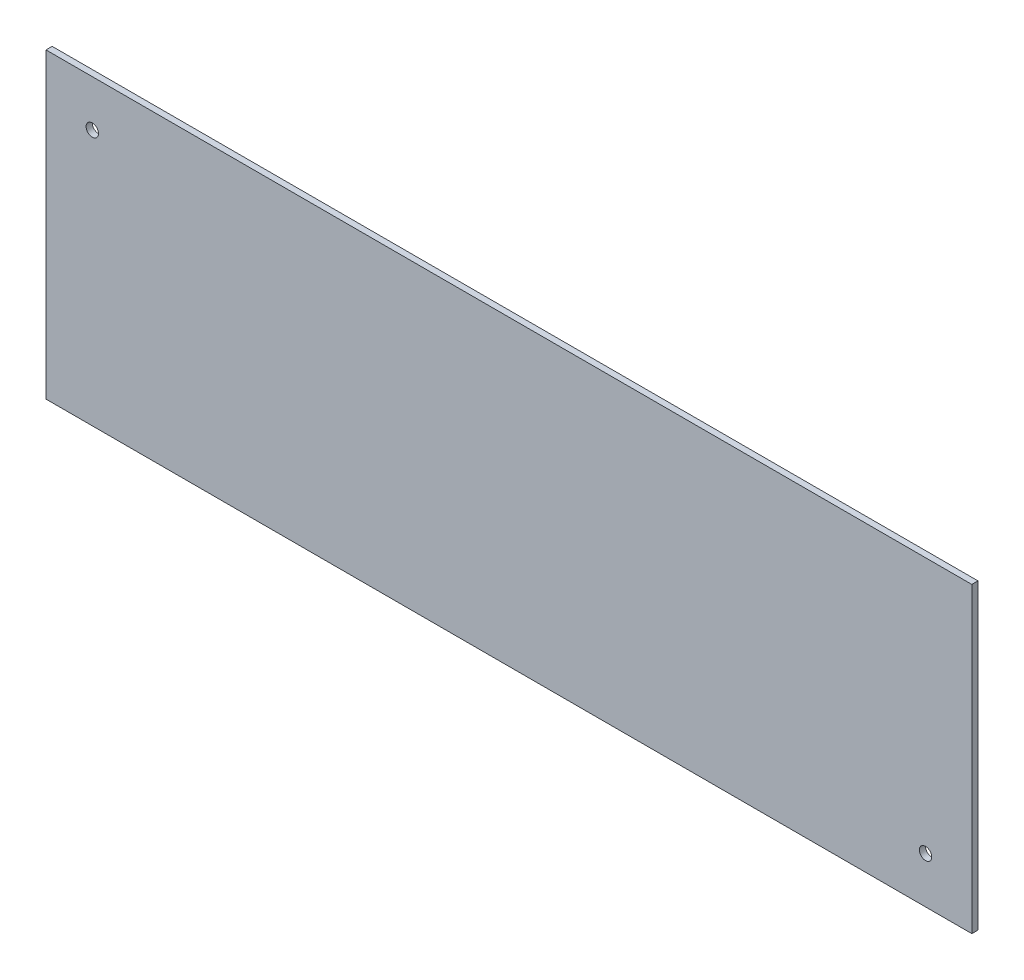
ISO-10303-21;
HEADER;
FILE_DESCRIPTION(('STEP AP214'),'2;1');
FILE_NAME('part.step','',(''),(''),'','','');
FILE_SCHEMA(('AUTOMOTIVE_DESIGN { 1 0 10303 214 1 1 1 1 }'));
ENDSEC;
DATA;
#1=APPLICATION_CONTEXT('core data for automotive mechanical design processes');
#2=APPLICATION_PROTOCOL_DEFINITION('international standard','automotive_design',2000,#1);
#3=PRODUCT_CONTEXT('',#1,'mechanical');
#4=PRODUCT('Part','Part','',(#3));
#5=PRODUCT_RELATED_PRODUCT_CATEGORY('part','',(#4));
#6=PRODUCT_DEFINITION_FORMATION('','',#4);
#7=PRODUCT_DEFINITION_CONTEXT('part definition',#1,'design');
#8=PRODUCT_DEFINITION('design','',#6,#7);
#9=PRODUCT_DEFINITION_SHAPE('','',#8);
#10=(LENGTH_UNIT() NAMED_UNIT(*) SI_UNIT(.MILLI.,.METRE.));
#11=(NAMED_UNIT(*) PLANE_ANGLE_UNIT() SI_UNIT($,.RADIAN.));
#12=(NAMED_UNIT(*) SI_UNIT($,.STERADIAN.) SOLID_ANGLE_UNIT());
#13=UNCERTAINTY_MEASURE_WITH_UNIT(LENGTH_MEASURE(1.E-05),#10,'distance_accuracy_value','');
#14=(GEOMETRIC_REPRESENTATION_CONTEXT(3) GLOBAL_UNCERTAINTY_ASSIGNED_CONTEXT((#13)) GLOBAL_UNIT_ASSIGNED_CONTEXT((#10,
#11,#12)) REPRESENTATION_CONTEXT('',''));
#15=CARTESIAN_POINT('',(0.,0.,0.));
#16=DIRECTION('',(0.,0.,1.));
#17=DIRECTION('',(1.,0.,0.));
#18=AXIS2_PLACEMENT_3D('',#15,#16,#17);
#19=CARTESIAN_POINT('',(150.,49.,2.));
#20=DIRECTION('',(-1.,0.,0.));
#21=DIRECTION('',(0.,0.,1.));
#22=AXIS2_PLACEMENT_3D('',#19,#20,#21);
#23=PLANE('',#22);
#24=DIRECTION('',(0.,1.,0.));
#25=VECTOR('',#24,1.);
#26=CARTESIAN_POINT('',(150.,49.,0.));
#27=LINE('',#26,#25);
#28=CARTESIAN_POINT('',(150.,-49.,0.));
#29=VERTEX_POINT('',#28);
#30=CARTESIAN_POINT('',(150.,49.,0.));
#31=VERTEX_POINT('',#30);
#32=EDGE_CURVE('E97',#29,#31,#27,.T.);
#33=ORIENTED_EDGE('',*,*,#32,.T.);
#34=DIRECTION('',(0.,0.,-1.));
#35=VECTOR('',#34,1.);
#36=CARTESIAN_POINT('',(150.,49.,2.));
#37=LINE('',#36,#35);
#38=CARTESIAN_POINT('',(150.,49.,2.));
#39=VERTEX_POINT('',#38);
#40=EDGE_CURVE('E11',#39,#31,#37,.T.);
#41=ORIENTED_EDGE('',*,*,#40,.F.);
#42=DIRECTION('',(0.,1.,0.));
#43=VECTOR('',#42,1.);
#44=CARTESIAN_POINT('',(150.,49.,2.));
#45=LINE('',#44,#43);
#46=CARTESIAN_POINT('',(150.,-49.,2.));
#47=VERTEX_POINT('',#46);
#48=EDGE_CURVE('E85',#47,#39,#45,.T.);
#49=ORIENTED_EDGE('',*,*,#48,.F.);
#50=DIRECTION('',(0.,0.,-1.));
#51=VECTOR('',#50,1.);
#52=CARTESIAN_POINT('',(150.,-49.,2.));
#53=LINE('',#52,#51);
#54=EDGE_CURVE('E93',#47,#29,#53,.T.);
#55=ORIENTED_EDGE('',*,*,#54,.T.);
#56=EDGE_LOOP('',(#33,#41,#49,#55));
#57=FACE_BOUND('',#56,.T.);
#58=ADVANCED_FACE('F34',(#57),#23,.F.);
#59=CARTESIAN_POINT('',(-150.,49.,2.));
#60=DIRECTION('',(0.,-1.,0.));
#61=DIRECTION('',(0.,0.,-1.));
#62=AXIS2_PLACEMENT_3D('',#59,#60,#61);
#63=PLANE('',#62);
#64=DIRECTION('',(-1.,0.,0.));
#65=VECTOR('',#64,1.);
#66=CARTESIAN_POINT('',(-150.,49.,0.));
#67=LINE('',#66,#65);
#68=CARTESIAN_POINT('',(-150.,49.,0.));
#69=VERTEX_POINT('',#68);
#70=EDGE_CURVE('E89',#31,#69,#67,.T.);
#71=ORIENTED_EDGE('',*,*,#70,.T.);
#72=DIRECTION('',(0.,0.,-1.));
#73=VECTOR('',#72,1.);
#74=CARTESIAN_POINT('',(-150.,49.,2.));
#75=LINE('',#74,#73);
#76=CARTESIAN_POINT('',(-150.,49.,2.));
#77=VERTEX_POINT('',#76);
#78=EDGE_CURVE('E42',#77,#69,#75,.T.);
#79=ORIENTED_EDGE('',*,*,#78,.F.);
#80=DIRECTION('',(-1.,0.,0.));
#81=VECTOR('',#80,1.);
#82=CARTESIAN_POINT('',(-150.,49.,2.));
#83=LINE('',#82,#81);
#84=EDGE_CURVE('E80',#39,#77,#83,.T.);
#85=ORIENTED_EDGE('',*,*,#84,.F.);
#86=ORIENTED_EDGE('',*,*,#40,.T.);
#87=EDGE_LOOP('',(#71,#79,#85,#86));
#88=FACE_BOUND('',#87,.T.);
#89=ADVANCED_FACE('F88',(#88),#63,.F.);
#90=CARTESIAN_POINT('',(-150.,49.,2.));
#91=DIRECTION('',(1.,0.,0.));
#92=DIRECTION('',(0.,0.,-1.));
#93=AXIS2_PLACEMENT_3D('',#90,#91,#92);
#94=PLANE('',#93);
#95=DIRECTION('',(0.,-1.,0.));
#96=VECTOR('',#95,1.);
#97=CARTESIAN_POINT('',(-150.,49.,0.));
#98=LINE('',#97,#96);
#99=CARTESIAN_POINT('',(-150.,-49.,0.));
#100=VERTEX_POINT('',#99);
#101=EDGE_CURVE('E67',#69,#100,#98,.T.);
#102=ORIENTED_EDGE('',*,*,#101,.T.);
#103=DIRECTION('',(0.,0.,-1.));
#104=VECTOR('',#103,1.);
#105=CARTESIAN_POINT('',(-150.,-49.,2.));
#106=LINE('',#105,#104);
#107=CARTESIAN_POINT('',(-150.,-49.,2.));
#108=VERTEX_POINT('',#107);
#109=EDGE_CURVE('E90',#108,#100,#106,.T.);
#110=ORIENTED_EDGE('',*,*,#109,.F.);
#111=DIRECTION('',(0.,-1.,0.));
#112=VECTOR('',#111,1.);
#113=CARTESIAN_POINT('',(-150.,49.,2.));
#114=LINE('',#113,#112);
#115=EDGE_CURVE('E83',#77,#108,#114,.T.);
#116=ORIENTED_EDGE('',*,*,#115,.F.);
#117=ORIENTED_EDGE('',*,*,#78,.T.);
#118=EDGE_LOOP('',(#102,#110,#116,#117));
#119=FACE_BOUND('',#118,.T.);
#120=ADVANCED_FACE('F91',(#119),#94,.F.);
#121=CARTESIAN_POINT('',(-150.,-49.,2.));
#122=DIRECTION('',(0.,1.,0.));
#123=DIRECTION('',(0.,0.,1.));
#124=AXIS2_PLACEMENT_3D('',#121,#122,#123);
#125=PLANE('',#124);
#126=DIRECTION('',(1.,0.,0.));
#127=VECTOR('',#126,1.);
#128=CARTESIAN_POINT('',(-150.,-49.,0.));
#129=LINE('',#128,#127);
#130=EDGE_CURVE('E73',#100,#29,#129,.T.);
#131=ORIENTED_EDGE('',*,*,#130,.T.);
#132=ORIENTED_EDGE('',*,*,#54,.F.);
#133=DIRECTION('',(1.,0.,0.));
#134=VECTOR('',#133,1.);
#135=CARTESIAN_POINT('',(-150.,-49.,2.));
#136=LINE('',#135,#134);
#137=EDGE_CURVE('E50',#108,#47,#136,.T.);
#138=ORIENTED_EDGE('',*,*,#137,.F.);
#139=ORIENTED_EDGE('',*,*,#109,.T.);
#140=EDGE_LOOP('',(#131,#132,#138,#139));
#141=FACE_BOUND('',#140,.T.);
#142=ADVANCED_FACE('F105',(#141),#125,.F.);
#143=CARTESIAN_POINT('',(0.,0.,2.));
#144=DIRECTION('',(0.,0.,1.));
#145=DIRECTION('',(1.,0.,0.));
#146=AXIS2_PLACEMENT_3D('',#143,#144,#145);
#147=PLANE('',#146);
#148=CARTESIAN_POINT('',(-135.,34.,2.));
#149=DIRECTION('',(0.,0.,1.));
#150=DIRECTION('',(1.,0.,0.));
#151=AXIS2_PLACEMENT_3D('',#148,#149,#150);
#152=CIRCLE('',#151,2.);
#153=CARTESIAN_POINT('',(-133.,34.,2.));
#154=VERTEX_POINT('',#153);
#155=EDGE_CURVE('E117',#154,#154,#152,.T.);
#156=ORIENTED_EDGE('',*,*,#155,.F.);
#157=EDGE_LOOP('',(#156));
#158=FACE_BOUND('',#157,.T.);
#159=CARTESIAN_POINT('',(135.,-34.,2.));
#160=DIRECTION('',(0.,0.,1.));
#161=DIRECTION('',(1.,0.,0.));
#162=AXIS2_PLACEMENT_3D('',#159,#160,#161);
#163=CIRCLE('',#162,2.);
#164=CARTESIAN_POINT('',(137.,-34.,2.));
#165=VERTEX_POINT('',#164);
#166=EDGE_CURVE('E111',#165,#165,#163,.T.);
#167=ORIENTED_EDGE('',*,*,#166,.F.);
#168=EDGE_LOOP('',(#167));
#169=FACE_BOUND('',#168,.T.);
#170=ORIENTED_EDGE('',*,*,#48,.T.);
#171=ORIENTED_EDGE('',*,*,#84,.T.);
#172=ORIENTED_EDGE('',*,*,#115,.T.);
#173=ORIENTED_EDGE('',*,*,#137,.T.);
#174=EDGE_LOOP('',(#170,#171,#172,#173));
#175=FACE_BOUND('',#174,.T.);
#176=ADVANCED_FACE('F81',(#158,#169,#175),#147,.T.);
#177=CARTESIAN_POINT('',(0.,0.,0.));
#178=DIRECTION('',(0.,0.,1.));
#179=DIRECTION('',(1.,0.,0.));
#180=AXIS2_PLACEMENT_3D('',#177,#178,#179);
#181=PLANE('',#180);
#182=CARTESIAN_POINT('',(-135.,34.,0.));
#183=DIRECTION('',(0.,0.,1.));
#184=DIRECTION('',(1.,0.,0.));
#185=AXIS2_PLACEMENT_3D('',#182,#183,#184);
#186=CIRCLE('',#185,2.);
#187=CARTESIAN_POINT('',(-133.,34.,0.));
#188=VERTEX_POINT('',#187);
#189=EDGE_CURVE('E100',#188,#188,#186,.T.);
#190=ORIENTED_EDGE('',*,*,#189,.T.);
#191=EDGE_LOOP('',(#190));
#192=FACE_BOUND('',#191,.T.);
#193=CARTESIAN_POINT('',(135.,-34.,0.));
#194=DIRECTION('',(0.,0.,1.));
#195=DIRECTION('',(1.,0.,0.));
#196=AXIS2_PLACEMENT_3D('',#193,#194,#195);
#197=CIRCLE('',#196,2.);
#198=CARTESIAN_POINT('',(137.,-34.,0.));
#199=VERTEX_POINT('',#198);
#200=EDGE_CURVE('E114',#199,#199,#197,.T.);
#201=ORIENTED_EDGE('',*,*,#200,.T.);
#202=EDGE_LOOP('',(#201));
#203=FACE_BOUND('',#202,.T.);
#204=ORIENTED_EDGE('',*,*,#32,.F.);
#205=ORIENTED_EDGE('',*,*,#130,.F.);
#206=ORIENTED_EDGE('',*,*,#101,.F.);
#207=ORIENTED_EDGE('',*,*,#70,.F.);
#208=EDGE_LOOP('',(#204,#205,#206,#207));
#209=FACE_BOUND('',#208,.T.);
#210=ADVANCED_FACE('F108',(#192,#203,#209),#181,.F.);
#211=CARTESIAN_POINT('',(135.,-34.,0.));
#212=DIRECTION('',(0.,0.,1.));
#213=DIRECTION('',(1.,0.,0.));
#214=AXIS2_PLACEMENT_3D('',#211,#212,#213);
#215=CYLINDRICAL_SURFACE('',#214,2.);
#216=ORIENTED_EDGE('',*,*,#200,.F.);
#217=EDGE_LOOP('',(#216));
#218=FACE_BOUND('',#217,.T.);
#219=ORIENTED_EDGE('',*,*,#166,.T.);
#220=EDGE_LOOP('',(#219));
#221=FACE_BOUND('',#220,.T.);
#222=ADVANCED_FACE('F128',(#218,#221),#215,.F.);
#223=CARTESIAN_POINT('',(-135.,34.,0.));
#224=DIRECTION('',(0.,0.,1.));
#225=DIRECTION('',(1.,0.,0.));
#226=AXIS2_PLACEMENT_3D('',#223,#224,#225);
#227=CYLINDRICAL_SURFACE('',#226,2.);
#228=ORIENTED_EDGE('',*,*,#189,.F.);
#229=EDGE_LOOP('',(#228));
#230=FACE_BOUND('',#229,.T.);
#231=ORIENTED_EDGE('',*,*,#155,.T.);
#232=EDGE_LOOP('',(#231));
#233=FACE_BOUND('',#232,.T.);
#234=ADVANCED_FACE('F125',(#230,#233),#227,.F.);
#235=CLOSED_SHELL('',(#58,#89,#120,#142,#176,#210,#222,#234));
#236=MANIFOLD_SOLID_BREP('B2',#235);
#237=ADVANCED_BREP_SHAPE_REPRESENTATION('',(#18,#236),#14);
#238=SHAPE_DEFINITION_REPRESENTATION(#9,#237);
ENDSEC;
END-ISO-10303-21;
